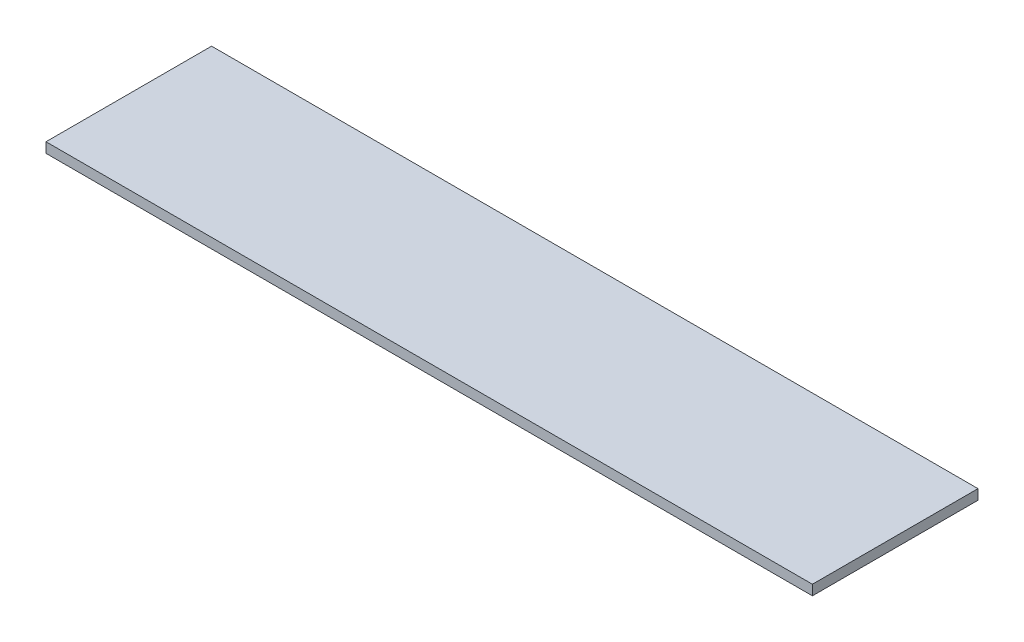
ISO-10303-21;
HEADER;
FILE_DESCRIPTION(('STEP AP214'),'2;1');
FILE_NAME('part.step','',(''),(''),'','','');
FILE_SCHEMA(('AUTOMOTIVE_DESIGN { 1 0 10303 214 1 1 1 1 }'));
ENDSEC;
DATA;
#1=APPLICATION_CONTEXT('core data for automotive mechanical design processes');
#2=APPLICATION_PROTOCOL_DEFINITION('international standard','automotive_design',2000,#1);
#3=PRODUCT_CONTEXT('',#1,'mechanical');
#4=PRODUCT('Part','Part','',(#3));
#5=PRODUCT_RELATED_PRODUCT_CATEGORY('part','',(#4));
#6=PRODUCT_DEFINITION_FORMATION('','',#4);
#7=PRODUCT_DEFINITION_CONTEXT('part definition',#1,'design');
#8=PRODUCT_DEFINITION('design','',#6,#7);
#9=PRODUCT_DEFINITION_SHAPE('','',#8);
#10=(LENGTH_UNIT() NAMED_UNIT(*) SI_UNIT(.MILLI.,.METRE.));
#11=(NAMED_UNIT(*) PLANE_ANGLE_UNIT() SI_UNIT($,.RADIAN.));
#12=(NAMED_UNIT(*) SI_UNIT($,.STERADIAN.) SOLID_ANGLE_UNIT());
#13=UNCERTAINTY_MEASURE_WITH_UNIT(LENGTH_MEASURE(1.E-05),#10,'distance_accuracy_value','');
#14=(GEOMETRIC_REPRESENTATION_CONTEXT(3) GLOBAL_UNCERTAINTY_ASSIGNED_CONTEXT((#13)) GLOBAL_UNIT_ASSIGNED_CONTEXT((#10,
#11,#12)) REPRESENTATION_CONTEXT('',''));
#15=CARTESIAN_POINT('',(0.,0.,0.));
#16=DIRECTION('',(0.,0.,1.));
#17=DIRECTION('',(1.,0.,0.));
#18=AXIS2_PLACEMENT_3D('',#15,#16,#17);
#19=CARTESIAN_POINT('',(-113.111115018818,2.54,1.81836788745393));
#20=DIRECTION('',(1.,0.,0.));
#21=DIRECTION('',(0.,0.,-1.));
#22=AXIS2_PLACEMENT_3D('',#19,#20,#21);
#23=PLANE('',#22);
#24=DIRECTION('',(0.,0.,1.));
#25=VECTOR('',#24,1.);
#26=CARTESIAN_POINT('',(-113.111115018818,0.,1.81836788745393));
#27=LINE('',#26,#25);
#28=CARTESIAN_POINT('',(-113.111115018818,0.,1.81836788745393));
#29=VERTEX_POINT('',#28);
#30=CARTESIAN_POINT('',(-113.111115018818,0.,43.5645787659227));
#31=VERTEX_POINT('',#30);
#32=EDGE_CURVE('E95',#29,#31,#27,.T.);
#33=ORIENTED_EDGE('',*,*,#32,.T.);
#34=DIRECTION('',(0.,-1.,0.));
#35=VECTOR('',#34,1.);
#36=CARTESIAN_POINT('',(-113.111115018818,2.54,43.5645787659227));
#37=LINE('',#36,#35);
#38=CARTESIAN_POINT('',(-113.111115018818,2.54,43.5645787659227));
#39=VERTEX_POINT('',#38);
#40=EDGE_CURVE('E11',#39,#31,#37,.T.);
#41=ORIENTED_EDGE('',*,*,#40,.F.);
#42=DIRECTION('',(0.,0.,1.));
#43=VECTOR('',#42,1.);
#44=CARTESIAN_POINT('',(-113.111115018818,2.54,1.81836788745393));
#45=LINE('',#44,#43);
#46=CARTESIAN_POINT('',(-113.111115018818,2.54,1.81836788745393));
#47=VERTEX_POINT('',#46);
#48=EDGE_CURVE('E83',#47,#39,#45,.T.);
#49=ORIENTED_EDGE('',*,*,#48,.F.);
#50=DIRECTION('',(0.,-1.,0.));
#51=VECTOR('',#50,1.);
#52=CARTESIAN_POINT('',(-113.111115018818,2.54,1.81836788745393));
#53=LINE('',#52,#51);
#54=EDGE_CURVE('E91',#47,#29,#53,.T.);
#55=ORIENTED_EDGE('',*,*,#54,.T.);
#56=EDGE_LOOP('',(#33,#41,#49,#55));
#57=FACE_BOUND('',#56,.T.);
#58=ADVANCED_FACE('F32',(#57),#23,.F.);
#59=CARTESIAN_POINT('',(-113.111115018818,2.54,43.5645787659227));
#60=DIRECTION('',(0.,0.,-1.));
#61=DIRECTION('',(-1.,0.,0.));
#62=AXIS2_PLACEMENT_3D('',#59,#60,#61);
#63=PLANE('',#62);
#64=DIRECTION('',(1.,0.,0.));
#65=VECTOR('',#64,1.);
#66=CARTESIAN_POINT('',(-113.111115018818,0.,43.5645787659227));
#67=LINE('',#66,#65);
#68=CARTESIAN_POINT('',(80.1092728017915,0.,43.5645787659227));
#69=VERTEX_POINT('',#68);
#70=EDGE_CURVE('E87',#31,#69,#67,.T.);
#71=ORIENTED_EDGE('',*,*,#70,.T.);
#72=DIRECTION('',(0.,-1.,0.));
#73=VECTOR('',#72,1.);
#74=CARTESIAN_POINT('',(80.1092728017915,2.54,43.5645787659227));
#75=LINE('',#74,#73);
#76=CARTESIAN_POINT('',(80.1092728017915,2.54,43.5645787659227));
#77=VERTEX_POINT('',#76);
#78=EDGE_CURVE('E40',#77,#69,#75,.T.);
#79=ORIENTED_EDGE('',*,*,#78,.F.);
#80=DIRECTION('',(1.,0.,0.));
#81=VECTOR('',#80,1.);
#82=CARTESIAN_POINT('',(-113.111115018818,2.54,43.5645787659227));
#83=LINE('',#82,#81);
#84=EDGE_CURVE('E78',#39,#77,#83,.T.);
#85=ORIENTED_EDGE('',*,*,#84,.F.);
#86=ORIENTED_EDGE('',*,*,#40,.T.);
#87=EDGE_LOOP('',(#71,#79,#85,#86));
#88=FACE_BOUND('',#87,.T.);
#89=ADVANCED_FACE('F86',(#88),#63,.F.);
#90=CARTESIAN_POINT('',(80.1092728017915,2.54,1.81836788745393));
#91=DIRECTION('',(-1.,0.,0.));
#92=DIRECTION('',(0.,0.,1.));
#93=AXIS2_PLACEMENT_3D('',#90,#91,#92);
#94=PLANE('',#93);
#95=DIRECTION('',(0.,0.,-1.));
#96=VECTOR('',#95,1.);
#97=CARTESIAN_POINT('',(80.1092728017915,0.,1.81836788745393));
#98=LINE('',#97,#96);
#99=CARTESIAN_POINT('',(80.1092728017915,0.,1.81836788745393));
#100=VERTEX_POINT('',#99);
#101=EDGE_CURVE('E65',#69,#100,#98,.T.);
#102=ORIENTED_EDGE('',*,*,#101,.T.);
#103=DIRECTION('',(0.,-1.,0.));
#104=VECTOR('',#103,1.);
#105=CARTESIAN_POINT('',(80.1092728017915,2.54,1.81836788745393));
#106=LINE('',#105,#104);
#107=CARTESIAN_POINT('',(80.1092728017915,2.54,1.81836788745393));
#108=VERTEX_POINT('',#107);
#109=EDGE_CURVE('E88',#108,#100,#106,.T.);
#110=ORIENTED_EDGE('',*,*,#109,.F.);
#111=DIRECTION('',(0.,0.,-1.));
#112=VECTOR('',#111,1.);
#113=CARTESIAN_POINT('',(80.1092728017915,2.54,1.81836788745393));
#114=LINE('',#113,#112);
#115=EDGE_CURVE('E81',#77,#108,#114,.T.);
#116=ORIENTED_EDGE('',*,*,#115,.F.);
#117=ORIENTED_EDGE('',*,*,#78,.T.);
#118=EDGE_LOOP('',(#102,#110,#116,#117));
#119=FACE_BOUND('',#118,.T.);
#120=ADVANCED_FACE('F89',(#119),#94,.F.);
#121=CARTESIAN_POINT('',(-113.111115018818,2.54,1.81836788745393));
#122=DIRECTION('',(0.,0.,1.));
#123=DIRECTION('',(1.,0.,0.));
#124=AXIS2_PLACEMENT_3D('',#121,#122,#123);
#125=PLANE('',#124);
#126=DIRECTION('',(-1.,0.,0.));
#127=VECTOR('',#126,1.);
#128=CARTESIAN_POINT('',(-113.111115018818,0.,1.81836788745393));
#129=LINE('',#128,#127);
#130=EDGE_CURVE('E71',#100,#29,#129,.T.);
#131=ORIENTED_EDGE('',*,*,#130,.T.);
#132=ORIENTED_EDGE('',*,*,#54,.F.);
#133=DIRECTION('',(-1.,0.,0.));
#134=VECTOR('',#133,1.);
#135=CARTESIAN_POINT('',(-113.111115018818,2.54,1.81836788745393));
#136=LINE('',#135,#134);
#137=EDGE_CURVE('E48',#108,#47,#136,.T.);
#138=ORIENTED_EDGE('',*,*,#137,.F.);
#139=ORIENTED_EDGE('',*,*,#109,.T.);
#140=EDGE_LOOP('',(#131,#132,#138,#139));
#141=FACE_BOUND('',#140,.T.);
#142=ADVANCED_FACE('F102',(#141),#125,.F.);
#143=CARTESIAN_POINT('',(-113.111115018818,2.54,43.5645787659227));
#144=DIRECTION('',(0.,1.,0.));
#145=DIRECTION('',(0.,0.,1.));
#146=AXIS2_PLACEMENT_3D('',#143,#144,#145);
#147=PLANE('',#146);
#148=ORIENTED_EDGE('',*,*,#48,.T.);
#149=ORIENTED_EDGE('',*,*,#84,.T.);
#150=ORIENTED_EDGE('',*,*,#115,.T.);
#151=ORIENTED_EDGE('',*,*,#137,.T.);
#152=EDGE_LOOP('',(#148,#149,#150,#151));
#153=FACE_BOUND('',#152,.T.);
#154=ADVANCED_FACE('F79',(#153),#147,.T.);
#155=CARTESIAN_POINT('',(-113.111115018818,0.,43.5645787659227));
#156=DIRECTION('',(0.,1.,0.));
#157=DIRECTION('',(0.,0.,1.));
#158=AXIS2_PLACEMENT_3D('',#155,#156,#157);
#159=PLANE('',#158);
#160=ORIENTED_EDGE('',*,*,#32,.F.);
#161=ORIENTED_EDGE('',*,*,#130,.F.);
#162=ORIENTED_EDGE('',*,*,#101,.F.);
#163=ORIENTED_EDGE('',*,*,#70,.F.);
#164=EDGE_LOOP('',(#160,#161,#162,#163));
#165=FACE_BOUND('',#164,.T.);
#166=ADVANCED_FACE('F105',(#165),#159,.F.);
#167=CLOSED_SHELL('',(#58,#89,#120,#142,#154,#166));
#168=MANIFOLD_SOLID_BREP('B2',#167);
#169=ADVANCED_BREP_SHAPE_REPRESENTATION('',(#18,#168),#14);
#170=SHAPE_DEFINITION_REPRESENTATION(#9,#169);
ENDSEC;
END-ISO-10303-21;
